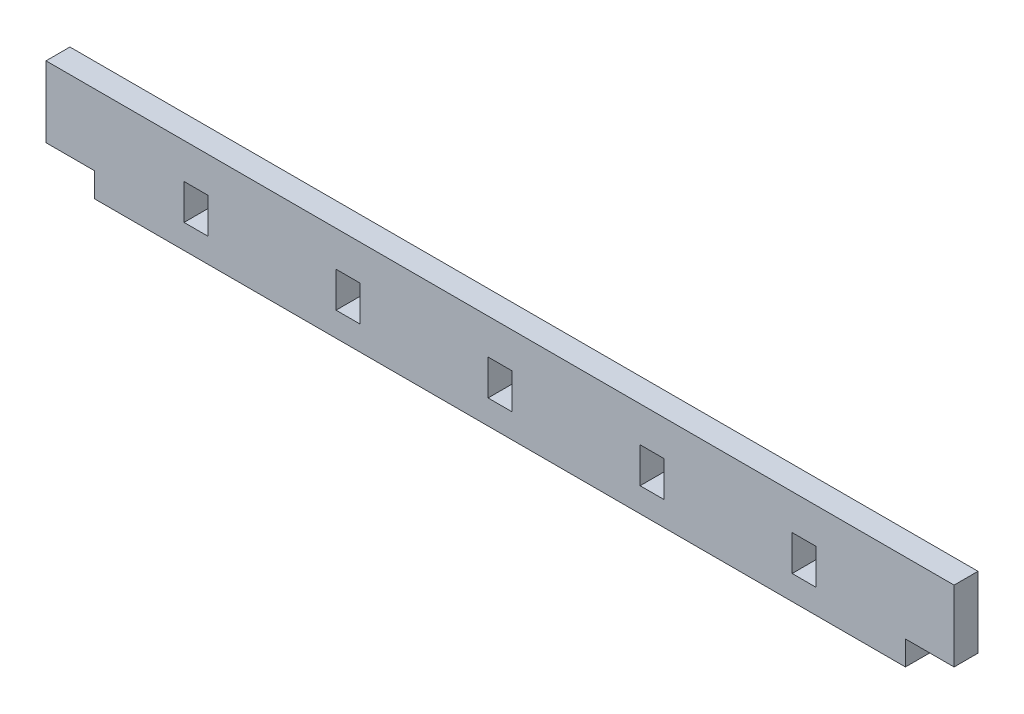
ISO-10303-21;
HEADER;
FILE_DESCRIPTION(('STEP AP214'),'2;1');
FILE_NAME('part.step','',(''),(''),'','','');
FILE_SCHEMA(('AUTOMOTIVE_DESIGN { 1 0 10303 214 1 1 1 1 }'));
ENDSEC;
DATA;
#1=APPLICATION_CONTEXT('core data for automotive mechanical design processes');
#2=APPLICATION_PROTOCOL_DEFINITION('international standard','automotive_design',2000,#1);
#3=PRODUCT_CONTEXT('',#1,'mechanical');
#4=PRODUCT('Part','Part','',(#3));
#5=PRODUCT_RELATED_PRODUCT_CATEGORY('part','',(#4));
#6=PRODUCT_DEFINITION_FORMATION('','',#4);
#7=PRODUCT_DEFINITION_CONTEXT('part definition',#1,'design');
#8=PRODUCT_DEFINITION('design','',#6,#7);
#9=PRODUCT_DEFINITION_SHAPE('','',#8);
#10=(LENGTH_UNIT() NAMED_UNIT(*) SI_UNIT(.MILLI.,.METRE.));
#11=(NAMED_UNIT(*) PLANE_ANGLE_UNIT() SI_UNIT($,.RADIAN.));
#12=(NAMED_UNIT(*) SI_UNIT($,.STERADIAN.) SOLID_ANGLE_UNIT());
#13=UNCERTAINTY_MEASURE_WITH_UNIT(LENGTH_MEASURE(1.E-05),#10,'distance_accuracy_value','');
#14=(GEOMETRIC_REPRESENTATION_CONTEXT(3) GLOBAL_UNCERTAINTY_ASSIGNED_CONTEXT((#13)) GLOBAL_UNIT_ASSIGNED_CONTEXT((#10,
#11,#12)) REPRESENTATION_CONTEXT('',''));
#15=CARTESIAN_POINT('',(0.,0.,0.));
#16=DIRECTION('',(0.,0.,1.));
#17=DIRECTION('',(1.,0.,0.));
#18=AXIS2_PLACEMENT_3D('',#15,#16,#17);
#19=CARTESIAN_POINT('',(0.,0.,2.9972));
#20=DIRECTION('',(0.,0.,1.));
#21=DIRECTION('',(1.,0.,0.));
#22=AXIS2_PLACEMENT_3D('',#19,#20,#21);
#23=PLANE('',#22);
#24=DIRECTION('',(-1.,0.,0.));
#25=VECTOR('',#24,1.);
#26=CARTESIAN_POINT('',(77.4446,14.8328,2.9972));
#27=LINE('',#26,#25);
#28=CARTESIAN_POINT('',(77.4446,14.8328,2.9972));
#29=VERTEX_POINT('',#28);
#30=CARTESIAN_POINT('',(74.4474,14.8328,2.9972));
#31=VERTEX_POINT('',#30);
#32=EDGE_CURVE('E256',#29,#31,#27,.T.);
#33=ORIENTED_EDGE('',*,*,#32,.F.);
#34=DIRECTION('',(0.,1.,0.));
#35=VECTOR('',#34,1.);
#36=CARTESIAN_POINT('',(77.4446,10.3878,2.9972));
#37=LINE('',#36,#35);
#38=CARTESIAN_POINT('',(77.4446,10.3878,2.9972));
#39=VERTEX_POINT('',#38);
#40=EDGE_CURVE('E254',#39,#29,#37,.T.);
#41=ORIENTED_EDGE('',*,*,#40,.F.);
#42=DIRECTION('',(1.,0.,0.));
#43=VECTOR('',#42,1.);
#44=CARTESIAN_POINT('',(77.4446,10.3878,2.9972));
#45=LINE('',#44,#43);
#46=CARTESIAN_POINT('',(74.4474,10.3878,2.9972));
#47=VERTEX_POINT('',#46);
#48=EDGE_CURVE('E262',#47,#39,#45,.T.);
#49=ORIENTED_EDGE('',*,*,#48,.F.);
#50=DIRECTION('',(0.,-1.,0.));
#51=VECTOR('',#50,1.);
#52=CARTESIAN_POINT('',(74.4474,10.3878,2.9972));
#53=LINE('',#52,#51);
#54=EDGE_CURVE('E259',#31,#47,#53,.T.);
#55=ORIENTED_EDGE('',*,*,#54,.F.);
#56=EDGE_LOOP('',(#33,#41,#49,#55));
#57=FACE_BOUND('',#56,.T.);
#58=DIRECTION('',(-1.,0.,0.));
#59=VECTOR('',#58,1.);
#60=CARTESIAN_POINT('',(39.3446,14.8328,2.9972));
#61=LINE('',#60,#59);
#62=CARTESIAN_POINT('',(39.3446,14.8328,2.9972));
#63=VERTEX_POINT('',#62);
#64=CARTESIAN_POINT('',(36.3474,14.8328,2.9972));
#65=VERTEX_POINT('',#64);
#66=EDGE_CURVE('E318',#63,#65,#61,.T.);
#67=ORIENTED_EDGE('',*,*,#66,.F.);
#68=DIRECTION('',(0.,1.,0.));
#69=VECTOR('',#68,1.);
#70=CARTESIAN_POINT('',(39.3446,10.3878,2.9972));
#71=LINE('',#70,#69);
#72=CARTESIAN_POINT('',(39.3446,10.3878,2.9972));
#73=VERTEX_POINT('',#72);
#74=EDGE_CURVE('E316',#73,#63,#71,.T.);
#75=ORIENTED_EDGE('',*,*,#74,.F.);
#76=DIRECTION('',(1.,0.,0.));
#77=VECTOR('',#76,1.);
#78=CARTESIAN_POINT('',(39.3446,10.3878,2.9972));
#79=LINE('',#78,#77);
#80=CARTESIAN_POINT('',(36.3474,10.3878,2.9972));
#81=VERTEX_POINT('',#80);
#82=EDGE_CURVE('E324',#81,#73,#79,.T.);
#83=ORIENTED_EDGE('',*,*,#82,.F.);
#84=DIRECTION('',(0.,-1.,0.));
#85=VECTOR('',#84,1.);
#86=CARTESIAN_POINT('',(36.3474,10.3878,2.9972));
#87=LINE('',#86,#85);
#88=EDGE_CURVE('E321',#65,#81,#87,.T.);
#89=ORIENTED_EDGE('',*,*,#88,.F.);
#90=EDGE_LOOP('',(#67,#75,#83,#89));
#91=FACE_BOUND('',#90,.T.);
#92=DIRECTION('',(-1.,0.,0.));
#93=VECTOR('',#92,1.);
#94=CARTESIAN_POINT('',(6.096,19.2778,2.9972));
#95=LINE('',#94,#93);
#96=CARTESIAN_POINT('',(113.792,19.2778,2.9972));
#97=VERTEX_POINT('',#96);
#98=CARTESIAN_POINT('',(0.,19.2778,2.9972));
#99=VERTEX_POINT('',#98);
#100=EDGE_CURVE('E378',#97,#99,#95,.T.);
#101=ORIENTED_EDGE('',*,*,#100,.T.);
#102=DIRECTION('',(0.,-1.,0.));
#103=VECTOR('',#102,1.);
#104=CARTESIAN_POINT('',(0.,19.2778,2.9972));
#105=LINE('',#104,#103);
#106=CARTESIAN_POINT('',(0.,10.3878,2.9972));
#107=VERTEX_POINT('',#106);
#108=EDGE_CURVE('E381',#99,#107,#105,.T.);
#109=ORIENTED_EDGE('',*,*,#108,.T.);
#110=DIRECTION('',(1.,0.,0.));
#111=VECTOR('',#110,1.);
#112=CARTESIAN_POINT('',(6.096,10.3878,2.9972));
#113=LINE('',#112,#111);
#114=CARTESIAN_POINT('',(6.096,10.3878,2.9972));
#115=VERTEX_POINT('',#114);
#116=EDGE_CURVE('E384',#107,#115,#113,.T.);
#117=ORIENTED_EDGE('',*,*,#116,.T.);
#118=DIRECTION('',(0.,-1.,0.));
#119=VECTOR('',#118,1.);
#120=CARTESIAN_POINT('',(6.096,7.33979999999998,2.9972));
#121=LINE('',#120,#119);
#122=CARTESIAN_POINT('',(6.096,7.33979999999998,2.9972));
#123=VERTEX_POINT('',#122);
#124=EDGE_CURVE('E386',#115,#123,#121,.T.);
#125=ORIENTED_EDGE('',*,*,#124,.T.);
#126=DIRECTION('',(1.,0.,0.));
#127=VECTOR('',#126,1.);
#128=CARTESIAN_POINT('',(107.696,7.33979999999999,2.9972));
#129=LINE('',#128,#127);
#130=CARTESIAN_POINT('',(107.696,7.33979999999999,2.9972));
#131=VERTEX_POINT('',#130);
#132=EDGE_CURVE('E388',#123,#131,#129,.T.);
#133=ORIENTED_EDGE('',*,*,#132,.T.);
#134=DIRECTION('',(0.,1.,0.));
#135=VECTOR('',#134,1.);
#136=CARTESIAN_POINT('',(107.696,10.3878,2.9972));
#137=LINE('',#136,#135);
#138=CARTESIAN_POINT('',(107.696,10.3878,2.9972));
#139=VERTEX_POINT('',#138);
#140=EDGE_CURVE('E390',#131,#139,#137,.T.);
#141=ORIENTED_EDGE('',*,*,#140,.T.);
#142=DIRECTION('',(1.,0.,0.));
#143=VECTOR('',#142,1.);
#144=CARTESIAN_POINT('',(113.792,10.3878,2.9972));
#145=LINE('',#144,#143);
#146=CARTESIAN_POINT('',(113.792,10.3878,2.9972));
#147=VERTEX_POINT('',#146);
#148=EDGE_CURVE('E392',#139,#147,#145,.T.);
#149=ORIENTED_EDGE('',*,*,#148,.T.);
#150=DIRECTION('',(0.,1.,0.));
#151=VECTOR('',#150,1.);
#152=CARTESIAN_POINT('',(113.792,19.2778,2.9972));
#153=LINE('',#152,#151);
#154=EDGE_CURVE('E394',#147,#97,#153,.T.);
#155=ORIENTED_EDGE('',*,*,#154,.T.);
#156=EDGE_LOOP('',(#101,#109,#117,#125,#133,#141,#149,#155));
#157=FACE_BOUND('',#156,.T.);
#158=DIRECTION('',(-1.,0.,0.));
#159=VECTOR('',#158,1.);
#160=CARTESIAN_POINT('',(20.2946,14.8328,2.9972));
#161=LINE('',#160,#159);
#162=CARTESIAN_POINT('',(20.2946,14.8328,2.9972));
#163=VERTEX_POINT('',#162);
#164=CARTESIAN_POINT('',(17.2974,14.8328,2.9972));
#165=VERTEX_POINT('',#164);
#166=EDGE_CURVE('E349',#163,#165,#161,.T.);
#167=ORIENTED_EDGE('',*,*,#166,.F.);
#168=DIRECTION('',(0.,1.,0.));
#169=VECTOR('',#168,1.);
#170=CARTESIAN_POINT('',(20.2946,10.3878,2.9972));
#171=LINE('',#170,#169);
#172=CARTESIAN_POINT('',(20.2946,10.3878,2.9972));
#173=VERTEX_POINT('',#172);
#174=EDGE_CURVE('E347',#173,#163,#171,.T.);
#175=ORIENTED_EDGE('',*,*,#174,.F.);
#176=DIRECTION('',(1.,0.,0.));
#177=VECTOR('',#176,1.);
#178=CARTESIAN_POINT('',(20.2946,10.3878,2.9972));
#179=LINE('',#178,#177);
#180=CARTESIAN_POINT('',(17.2974,10.3878,2.9972));
#181=VERTEX_POINT('',#180);
#182=EDGE_CURVE('E355',#181,#173,#179,.T.);
#183=ORIENTED_EDGE('',*,*,#182,.F.);
#184=DIRECTION('',(0.,-1.,0.));
#185=VECTOR('',#184,1.);
#186=CARTESIAN_POINT('',(17.2974,10.3878,2.9972));
#187=LINE('',#186,#185);
#188=EDGE_CURVE('E352',#165,#181,#187,.T.);
#189=ORIENTED_EDGE('',*,*,#188,.F.);
#190=EDGE_LOOP('',(#167,#175,#183,#189));
#191=FACE_BOUND('',#190,.T.);
#192=DIRECTION('',(0.,1.,0.));
#193=VECTOR('',#192,1.);
#194=CARTESIAN_POINT('',(58.3946,10.3878,2.9972));
#195=LINE('',#194,#193);
#196=CARTESIAN_POINT('',(58.3946,10.3878,2.9972));
#197=VERTEX_POINT('',#196);
#198=CARTESIAN_POINT('',(58.3946,14.8328,2.9972));
#199=VERTEX_POINT('',#198);
#200=EDGE_CURVE('E287',#197,#199,#195,.T.);
#201=ORIENTED_EDGE('',*,*,#200,.F.);
#202=DIRECTION('',(1.,0.,0.));
#203=VECTOR('',#202,1.);
#204=CARTESIAN_POINT('',(58.3946,10.3878,2.9972));
#205=LINE('',#204,#203);
#206=CARTESIAN_POINT('',(55.3974,10.3878,2.9972));
#207=VERTEX_POINT('',#206);
#208=EDGE_CURVE('E285',#207,#197,#205,.T.);
#209=ORIENTED_EDGE('',*,*,#208,.F.);
#210=DIRECTION('',(0.,-1.,0.));
#211=VECTOR('',#210,1.);
#212=CARTESIAN_POINT('',(55.3974,10.3878,2.9972));
#213=LINE('',#212,#211);
#214=CARTESIAN_POINT('',(55.3974,14.8328,2.9972));
#215=VERTEX_POINT('',#214);
#216=EDGE_CURVE('E293',#215,#207,#213,.T.);
#217=ORIENTED_EDGE('',*,*,#216,.F.);
#218=DIRECTION('',(-1.,0.,0.));
#219=VECTOR('',#218,1.);
#220=CARTESIAN_POINT('',(58.3946,14.8328,2.9972));
#221=LINE('',#220,#219);
#222=EDGE_CURVE('E290',#199,#215,#221,.T.);
#223=ORIENTED_EDGE('',*,*,#222,.F.);
#224=EDGE_LOOP('',(#201,#209,#217,#223));
#225=FACE_BOUND('',#224,.T.);
#226=DIRECTION('',(-1.,0.,0.));
#227=VECTOR('',#226,1.);
#228=CARTESIAN_POINT('',(96.4946,14.8328,2.9972));
#229=LINE('',#228,#227);
#230=CARTESIAN_POINT('',(96.4946,14.8328,2.9972));
#231=VERTEX_POINT('',#230);
#232=CARTESIAN_POINT('',(93.4974,14.8328,2.9972));
#233=VERTEX_POINT('',#232);
#234=EDGE_CURVE('E226',#231,#233,#229,.T.);
#235=ORIENTED_EDGE('',*,*,#234,.F.);
#236=DIRECTION('',(0.,1.,0.));
#237=VECTOR('',#236,1.);
#238=CARTESIAN_POINT('',(96.4946,10.3878,2.9972));
#239=LINE('',#238,#237);
#240=CARTESIAN_POINT('',(96.4946,10.3878,2.9972));
#241=VERTEX_POINT('',#240);
#242=EDGE_CURVE('E218',#241,#231,#239,.T.);
#243=ORIENTED_EDGE('',*,*,#242,.F.);
#244=DIRECTION('',(1.,0.,0.));
#245=VECTOR('',#244,1.);
#246=CARTESIAN_POINT('',(96.4946,10.3878,2.9972));
#247=LINE('',#246,#245);
#248=CARTESIAN_POINT('',(93.4974,10.3878,2.9972));
#249=VERTEX_POINT('',#248);
#250=EDGE_CURVE('E240',#249,#241,#247,.T.);
#251=ORIENTED_EDGE('',*,*,#250,.F.);
#252=DIRECTION('',(0.,-1.,0.));
#253=VECTOR('',#252,1.);
#254=CARTESIAN_POINT('',(93.4974,10.3878,2.9972));
#255=LINE('',#254,#253);
#256=EDGE_CURVE('E238',#233,#249,#255,.T.);
#257=ORIENTED_EDGE('',*,*,#256,.F.);
#258=EDGE_LOOP('',(#235,#243,#251,#257));
#259=FACE_BOUND('',#258,.T.);
#260=ADVANCED_FACE('F33',(#57,#91,#157,#191,#225,#259),#23,.T.);
#261=CARTESIAN_POINT('',(0.,0.,0.));
#262=DIRECTION('',(0.,0.,1.));
#263=DIRECTION('',(1.,0.,0.));
#264=AXIS2_PLACEMENT_3D('',#261,#262,#263);
#265=PLANE('',#264);
#266=DIRECTION('',(0.,1.,0.));
#267=VECTOR('',#266,1.);
#268=CARTESIAN_POINT('',(77.4446,10.3878,0.));
#269=LINE('',#268,#267);
#270=CARTESIAN_POINT('',(77.4446,10.3878,0.));
#271=VERTEX_POINT('',#270);
#272=CARTESIAN_POINT('',(77.4446,14.8328,0.));
#273=VERTEX_POINT('',#272);
#274=EDGE_CURVE('E234',#271,#273,#269,.T.);
#275=ORIENTED_EDGE('',*,*,#274,.T.);
#276=DIRECTION('',(-1.,0.,0.));
#277=VECTOR('',#276,1.);
#278=CARTESIAN_POINT('',(77.4446,14.8328,0.));
#279=LINE('',#278,#277);
#280=CARTESIAN_POINT('',(74.4474,14.8328,0.));
#281=VERTEX_POINT('',#280);
#282=EDGE_CURVE('E267',#273,#281,#279,.T.);
#283=ORIENTED_EDGE('',*,*,#282,.T.);
#284=DIRECTION('',(0.,-1.,0.));
#285=VECTOR('',#284,1.);
#286=CARTESIAN_POINT('',(74.4474,10.3878,0.));
#287=LINE('',#286,#285);
#288=CARTESIAN_POINT('',(74.4474,10.3878,0.));
#289=VERTEX_POINT('',#288);
#290=EDGE_CURVE('E270',#281,#289,#287,.T.);
#291=ORIENTED_EDGE('',*,*,#290,.T.);
#292=DIRECTION('',(1.,0.,0.));
#293=VECTOR('',#292,1.);
#294=CARTESIAN_POINT('',(77.4446,10.3878,0.));
#295=LINE('',#294,#293);
#296=EDGE_CURVE('E257',#289,#271,#295,.T.);
#297=ORIENTED_EDGE('',*,*,#296,.T.);
#298=EDGE_LOOP('',(#275,#283,#291,#297));
#299=FACE_BOUND('',#298,.T.);
#300=DIRECTION('',(0.,1.,0.));
#301=VECTOR('',#300,1.);
#302=CARTESIAN_POINT('',(39.3446,10.3878,0.));
#303=LINE('',#302,#301);
#304=CARTESIAN_POINT('',(39.3446,10.3878,0.));
#305=VERTEX_POINT('',#304);
#306=CARTESIAN_POINT('',(39.3446,14.8328,0.));
#307=VERTEX_POINT('',#306);
#308=EDGE_CURVE('E315',#305,#307,#303,.T.);
#309=ORIENTED_EDGE('',*,*,#308,.T.);
#310=DIRECTION('',(-1.,0.,0.));
#311=VECTOR('',#310,1.);
#312=CARTESIAN_POINT('',(39.3446,14.8328,0.));
#313=LINE('',#312,#311);
#314=CARTESIAN_POINT('',(36.3474,14.8328,0.));
#315=VERTEX_POINT('',#314);
#316=EDGE_CURVE('E329',#307,#315,#313,.T.);
#317=ORIENTED_EDGE('',*,*,#316,.T.);
#318=DIRECTION('',(0.,-1.,0.));
#319=VECTOR('',#318,1.);
#320=CARTESIAN_POINT('',(36.3474,10.3878,0.));
#321=LINE('',#320,#319);
#322=CARTESIAN_POINT('',(36.3474,10.3878,0.));
#323=VERTEX_POINT('',#322);
#324=EDGE_CURVE('E332',#315,#323,#321,.T.);
#325=ORIENTED_EDGE('',*,*,#324,.T.);
#326=DIRECTION('',(1.,0.,0.));
#327=VECTOR('',#326,1.);
#328=CARTESIAN_POINT('',(39.3446,10.3878,0.));
#329=LINE('',#328,#327);
#330=EDGE_CURVE('E319',#323,#305,#329,.T.);
#331=ORIENTED_EDGE('',*,*,#330,.T.);
#332=EDGE_LOOP('',(#309,#317,#325,#331));
#333=FACE_BOUND('',#332,.T.);
#334=DIRECTION('',(0.,-1.,0.));
#335=VECTOR('',#334,1.);
#336=CARTESIAN_POINT('',(0.,19.2778,0.));
#337=LINE('',#336,#335);
#338=CARTESIAN_POINT('',(0.,19.2778,0.));
#339=VERTEX_POINT('',#338);
#340=CARTESIAN_POINT('',(0.,10.3878,0.));
#341=VERTEX_POINT('',#340);
#342=EDGE_CURVE('E377',#339,#341,#337,.T.);
#343=ORIENTED_EDGE('',*,*,#342,.F.);
#344=DIRECTION('',(-1.,0.,0.));
#345=VECTOR('',#344,1.);
#346=CARTESIAN_POINT('',(6.096,19.2778,0.));
#347=LINE('',#346,#345);
#348=CARTESIAN_POINT('',(113.792,19.2778,0.));
#349=VERTEX_POINT('',#348);
#350=EDGE_CURVE('E382',#349,#339,#347,.T.);
#351=ORIENTED_EDGE('',*,*,#350,.F.);
#352=DIRECTION('',(0.,1.,0.));
#353=VECTOR('',#352,1.);
#354=CARTESIAN_POINT('',(113.792,19.2778,0.));
#355=LINE('',#354,#353);
#356=CARTESIAN_POINT('',(113.792,10.3878,0.));
#357=VERTEX_POINT('',#356);
#358=EDGE_CURVE('E409',#357,#349,#355,.T.);
#359=ORIENTED_EDGE('',*,*,#358,.F.);
#360=DIRECTION('',(1.,0.,0.));
#361=VECTOR('',#360,1.);
#362=CARTESIAN_POINT('',(113.792,10.3878,0.));
#363=LINE('',#362,#361);
#364=CARTESIAN_POINT('',(107.696,10.3878,0.));
#365=VERTEX_POINT('',#364);
#366=EDGE_CURVE('E407',#365,#357,#363,.T.);
#367=ORIENTED_EDGE('',*,*,#366,.F.);
#368=DIRECTION('',(0.,1.,0.));
#369=VECTOR('',#368,1.);
#370=CARTESIAN_POINT('',(107.696,10.3878,0.));
#371=LINE('',#370,#369);
#372=CARTESIAN_POINT('',(107.696,7.33979999999999,0.));
#373=VERTEX_POINT('',#372);
#374=EDGE_CURVE('E405',#373,#365,#371,.T.);
#375=ORIENTED_EDGE('',*,*,#374,.F.);
#376=DIRECTION('',(1.,0.,0.));
#377=VECTOR('',#376,1.);
#378=CARTESIAN_POINT('',(107.696,7.33979999999999,0.));
#379=LINE('',#378,#377);
#380=CARTESIAN_POINT('',(6.096,7.33979999999998,0.));
#381=VERTEX_POINT('',#380);
#382=EDGE_CURVE('E403',#381,#373,#379,.T.);
#383=ORIENTED_EDGE('',*,*,#382,.F.);
#384=DIRECTION('',(0.,-1.,0.));
#385=VECTOR('',#384,1.);
#386=CARTESIAN_POINT('',(6.096,7.33979999999998,0.));
#387=LINE('',#386,#385);
#388=CARTESIAN_POINT('',(6.096,10.3878,0.));
#389=VERTEX_POINT('',#388);
#390=EDGE_CURVE('E401',#389,#381,#387,.T.);
#391=ORIENTED_EDGE('',*,*,#390,.F.);
#392=DIRECTION('',(1.,0.,0.));
#393=VECTOR('',#392,1.);
#394=CARTESIAN_POINT('',(6.096,10.3878,0.));
#395=LINE('',#394,#393);
#396=EDGE_CURVE('E399',#341,#389,#395,.T.);
#397=ORIENTED_EDGE('',*,*,#396,.F.);
#398=EDGE_LOOP('',(#343,#351,#359,#367,#375,#383,#391,#397));
#399=FACE_BOUND('',#398,.T.);
#400=DIRECTION('',(0.,1.,0.));
#401=VECTOR('',#400,1.);
#402=CARTESIAN_POINT('',(20.2946,10.3878,0.));
#403=LINE('',#402,#401);
#404=CARTESIAN_POINT('',(20.2946,10.3878,0.));
#405=VERTEX_POINT('',#404);
#406=CARTESIAN_POINT('',(20.2946,14.8328,0.));
#407=VERTEX_POINT('',#406);
#408=EDGE_CURVE('E346',#405,#407,#403,.T.);
#409=ORIENTED_EDGE('',*,*,#408,.T.);
#410=DIRECTION('',(-1.,0.,0.));
#411=VECTOR('',#410,1.);
#412=CARTESIAN_POINT('',(20.2946,14.8328,0.));
#413=LINE('',#412,#411);
#414=CARTESIAN_POINT('',(17.2974,14.8328,0.));
#415=VERTEX_POINT('',#414);
#416=EDGE_CURVE('E360',#407,#415,#413,.T.);
#417=ORIENTED_EDGE('',*,*,#416,.T.);
#418=DIRECTION('',(0.,-1.,0.));
#419=VECTOR('',#418,1.);
#420=CARTESIAN_POINT('',(17.2974,10.3878,0.));
#421=LINE('',#420,#419);
#422=CARTESIAN_POINT('',(17.2974,10.3878,0.));
#423=VERTEX_POINT('',#422);
#424=EDGE_CURVE('E363',#415,#423,#421,.T.);
#425=ORIENTED_EDGE('',*,*,#424,.T.);
#426=DIRECTION('',(1.,0.,0.));
#427=VECTOR('',#426,1.);
#428=CARTESIAN_POINT('',(20.2946,10.3878,0.));
#429=LINE('',#428,#427);
#430=EDGE_CURVE('E350',#423,#405,#429,.T.);
#431=ORIENTED_EDGE('',*,*,#430,.T.);
#432=EDGE_LOOP('',(#409,#417,#425,#431));
#433=FACE_BOUND('',#432,.T.);
#434=DIRECTION('',(1.,0.,0.));
#435=VECTOR('',#434,1.);
#436=CARTESIAN_POINT('',(58.3946,10.3878,0.));
#437=LINE('',#436,#435);
#438=CARTESIAN_POINT('',(55.3974,10.3878,0.));
#439=VERTEX_POINT('',#438);
#440=CARTESIAN_POINT('',(58.3946,10.3878,0.));
#441=VERTEX_POINT('',#440);
#442=EDGE_CURVE('E284',#439,#441,#437,.T.);
#443=ORIENTED_EDGE('',*,*,#442,.T.);
#444=DIRECTION('',(0.,1.,0.));
#445=VECTOR('',#444,1.);
#446=CARTESIAN_POINT('',(58.3946,10.3878,0.));
#447=LINE('',#446,#445);
#448=CARTESIAN_POINT('',(58.3946,14.8328,0.));
#449=VERTEX_POINT('',#448);
#450=EDGE_CURVE('E298',#441,#449,#447,.T.);
#451=ORIENTED_EDGE('',*,*,#450,.T.);
#452=DIRECTION('',(-1.,0.,0.));
#453=VECTOR('',#452,1.);
#454=CARTESIAN_POINT('',(58.3946,14.8328,0.));
#455=LINE('',#454,#453);
#456=CARTESIAN_POINT('',(55.3974,14.8328,0.));
#457=VERTEX_POINT('',#456);
#458=EDGE_CURVE('E301',#449,#457,#455,.T.);
#459=ORIENTED_EDGE('',*,*,#458,.T.);
#460=DIRECTION('',(0.,-1.,0.));
#461=VECTOR('',#460,1.);
#462=CARTESIAN_POINT('',(55.3974,10.3878,0.));
#463=LINE('',#462,#461);
#464=EDGE_CURVE('E288',#457,#439,#463,.T.);
#465=ORIENTED_EDGE('',*,*,#464,.T.);
#466=EDGE_LOOP('',(#443,#451,#459,#465));
#467=FACE_BOUND('',#466,.T.);
#468=DIRECTION('',(0.,1.,0.));
#469=VECTOR('',#468,1.);
#470=CARTESIAN_POINT('',(96.4946,10.3878,0.));
#471=LINE('',#470,#469);
#472=CARTESIAN_POINT('',(96.4946,10.3878,0.));
#473=VERTEX_POINT('',#472);
#474=CARTESIAN_POINT('',(96.4946,14.8328,0.));
#475=VERTEX_POINT('',#474);
#476=EDGE_CURVE('E56',#473,#475,#471,.T.);
#477=ORIENTED_EDGE('',*,*,#476,.T.);
#478=DIRECTION('',(-1.,0.,0.));
#479=VECTOR('',#478,1.);
#480=CARTESIAN_POINT('',(96.4946,14.8328,0.));
#481=LINE('',#480,#479);
#482=CARTESIAN_POINT('',(93.4974,14.8328,0.));
#483=VERTEX_POINT('',#482);
#484=EDGE_CURVE('E233',#475,#483,#481,.T.);
#485=ORIENTED_EDGE('',*,*,#484,.T.);
#486=DIRECTION('',(0.,-1.,0.));
#487=VECTOR('',#486,1.);
#488=CARTESIAN_POINT('',(93.4974,10.3878,0.));
#489=LINE('',#488,#487);
#490=CARTESIAN_POINT('',(93.4974,10.3878,0.));
#491=VERTEX_POINT('',#490);
#492=EDGE_CURVE('E246',#483,#491,#489,.T.);
#493=ORIENTED_EDGE('',*,*,#492,.T.);
#494=DIRECTION('',(1.,0.,0.));
#495=VECTOR('',#494,1.);
#496=CARTESIAN_POINT('',(96.4946,10.3878,0.));
#497=LINE('',#496,#495);
#498=EDGE_CURVE('E227',#491,#473,#497,.T.);
#499=ORIENTED_EDGE('',*,*,#498,.T.);
#500=EDGE_LOOP('',(#477,#485,#493,#499));
#501=FACE_BOUND('',#500,.T.);
#502=ADVANCED_FACE('F440',(#299,#333,#399,#433,#467,#501),#265,.F.);
#503=CARTESIAN_POINT('',(0.,19.2778,2.9972));
#504=DIRECTION('',(1.,0.,0.));
#505=DIRECTION('',(0.,0.,-1.));
#506=AXIS2_PLACEMENT_3D('',#503,#504,#505);
#507=PLANE('',#506);
#508=ORIENTED_EDGE('',*,*,#342,.T.);
#509=DIRECTION('',(0.,0.,-1.));
#510=VECTOR('',#509,1.);
#511=CARTESIAN_POINT('',(0.,10.3878,2.9972));
#512=LINE('',#511,#510);
#513=EDGE_CURVE('E41',#107,#341,#512,.T.);
#514=ORIENTED_EDGE('',*,*,#513,.F.);
#515=ORIENTED_EDGE('',*,*,#108,.F.);
#516=DIRECTION('',(0.,0.,-1.));
#517=VECTOR('',#516,1.);
#518=CARTESIAN_POINT('',(0.,19.2778,2.9972));
#519=LINE('',#518,#517);
#520=EDGE_CURVE('E11',#99,#339,#519,.T.);
#521=ORIENTED_EDGE('',*,*,#520,.T.);
#522=EDGE_LOOP('',(#508,#514,#515,#521));
#523=FACE_BOUND('',#522,.T.);
#524=ADVANCED_FACE('F35',(#523),#507,.F.);
#525=CARTESIAN_POINT('',(6.096,10.3878,2.9972));
#526=DIRECTION('',(0.,1.,0.));
#527=DIRECTION('',(0.,0.,1.));
#528=AXIS2_PLACEMENT_3D('',#525,#526,#527);
#529=PLANE('',#528);
#530=ORIENTED_EDGE('',*,*,#396,.T.);
#531=DIRECTION('',(0.,0.,-1.));
#532=VECTOR('',#531,1.);
#533=CARTESIAN_POINT('',(6.096,10.3878,2.9972));
#534=LINE('',#533,#532);
#535=EDGE_CURVE('E427',#115,#389,#534,.T.);
#536=ORIENTED_EDGE('',*,*,#535,.F.);
#537=ORIENTED_EDGE('',*,*,#116,.F.);
#538=ORIENTED_EDGE('',*,*,#513,.T.);
#539=EDGE_LOOP('',(#530,#536,#537,#538));
#540=FACE_BOUND('',#539,.T.);
#541=ADVANCED_FACE('F434',(#540),#529,.F.);
#542=CARTESIAN_POINT('',(6.096,7.33979999999998,2.9972));
#543=DIRECTION('',(1.,0.,0.));
#544=DIRECTION('',(0.,1.,0.));
#545=AXIS2_PLACEMENT_3D('',#542,#543,#544);
#546=PLANE('',#545);
#547=ORIENTED_EDGE('',*,*,#390,.T.);
#548=DIRECTION('',(0.,0.,-1.));
#549=VECTOR('',#548,1.);
#550=CARTESIAN_POINT('',(6.096,7.33979999999998,2.9972));
#551=LINE('',#550,#549);
#552=EDGE_CURVE('E424',#123,#381,#551,.T.);
#553=ORIENTED_EDGE('',*,*,#552,.F.);
#554=ORIENTED_EDGE('',*,*,#124,.F.);
#555=ORIENTED_EDGE('',*,*,#535,.T.);
#556=EDGE_LOOP('',(#547,#553,#554,#555));
#557=FACE_BOUND('',#556,.T.);
#558=ADVANCED_FACE('F446',(#557),#546,.F.);
#559=CARTESIAN_POINT('',(107.696,7.33979999999999,2.9972));
#560=DIRECTION('',(0.,1.,0.));
#561=DIRECTION('',(-1.,0.,0.));
#562=AXIS2_PLACEMENT_3D('',#559,#560,#561);
#563=PLANE('',#562);
#564=ORIENTED_EDGE('',*,*,#382,.T.);
#565=DIRECTION('',(0.,0.,-1.));
#566=VECTOR('',#565,1.);
#567=CARTESIAN_POINT('',(107.696,7.33979999999999,2.9972));
#568=LINE('',#567,#566);
#569=EDGE_CURVE('E421',#131,#373,#568,.T.);
#570=ORIENTED_EDGE('',*,*,#569,.F.);
#571=ORIENTED_EDGE('',*,*,#132,.F.);
#572=ORIENTED_EDGE('',*,*,#552,.T.);
#573=EDGE_LOOP('',(#564,#570,#571,#572));
#574=FACE_BOUND('',#573,.T.);
#575=ADVANCED_FACE('F450',(#574),#563,.F.);
#576=CARTESIAN_POINT('',(107.696,10.3878,2.9972));
#577=DIRECTION('',(-1.,0.,0.));
#578=DIRECTION('',(0.,0.,1.));
#579=AXIS2_PLACEMENT_3D('',#576,#577,#578);
#580=PLANE('',#579);
#581=ORIENTED_EDGE('',*,*,#374,.T.);
#582=DIRECTION('',(0.,0.,-1.));
#583=VECTOR('',#582,1.);
#584=CARTESIAN_POINT('',(107.696,10.3878,2.9972));
#585=LINE('',#584,#583);
#586=EDGE_CURVE('E418',#139,#365,#585,.T.);
#587=ORIENTED_EDGE('',*,*,#586,.F.);
#588=ORIENTED_EDGE('',*,*,#140,.F.);
#589=ORIENTED_EDGE('',*,*,#569,.T.);
#590=EDGE_LOOP('',(#581,#587,#588,#589));
#591=FACE_BOUND('',#590,.T.);
#592=ADVANCED_FACE('F470',(#591),#580,.F.);
#593=CARTESIAN_POINT('',(113.792,10.3878,2.9972));
#594=DIRECTION('',(0.,1.,0.));
#595=DIRECTION('',(0.,0.,1.));
#596=AXIS2_PLACEMENT_3D('',#593,#594,#595);
#597=PLANE('',#596);
#598=ORIENTED_EDGE('',*,*,#366,.T.);
#599=DIRECTION('',(0.,0.,-1.));
#600=VECTOR('',#599,1.);
#601=CARTESIAN_POINT('',(113.792,10.3878,2.9972));
#602=LINE('',#601,#600);
#603=EDGE_CURVE('E415',#147,#357,#602,.T.);
#604=ORIENTED_EDGE('',*,*,#603,.F.);
#605=ORIENTED_EDGE('',*,*,#148,.F.);
#606=ORIENTED_EDGE('',*,*,#586,.T.);
#607=EDGE_LOOP('',(#598,#604,#605,#606));
#608=FACE_BOUND('',#607,.T.);
#609=ADVANCED_FACE('F468',(#608),#597,.F.);
#610=CARTESIAN_POINT('',(113.792,19.2778,2.9972));
#611=DIRECTION('',(-1.,0.,0.));
#612=DIRECTION('',(0.,0.,1.));
#613=AXIS2_PLACEMENT_3D('',#610,#611,#612);
#614=PLANE('',#613);
#615=ORIENTED_EDGE('',*,*,#358,.T.);
#616=DIRECTION('',(0.,0.,-1.));
#617=VECTOR('',#616,1.);
#618=CARTESIAN_POINT('',(113.792,19.2778,2.9972));
#619=LINE('',#618,#617);
#620=EDGE_CURVE('E397',#97,#349,#619,.T.);
#621=ORIENTED_EDGE('',*,*,#620,.F.);
#622=ORIENTED_EDGE('',*,*,#154,.F.);
#623=ORIENTED_EDGE('',*,*,#603,.T.);
#624=EDGE_LOOP('',(#615,#621,#622,#623));
#625=FACE_BOUND('',#624,.T.);
#626=ADVANCED_FACE('F463',(#625),#614,.F.);
#627=CARTESIAN_POINT('',(6.096,19.2778,2.9972));
#628=DIRECTION('',(0.,-1.,0.));
#629=DIRECTION('',(0.,0.,-1.));
#630=AXIS2_PLACEMENT_3D('',#627,#628,#629);
#631=PLANE('',#630);
#632=ORIENTED_EDGE('',*,*,#350,.T.);
#633=ORIENTED_EDGE('',*,*,#520,.F.);
#634=ORIENTED_EDGE('',*,*,#100,.F.);
#635=ORIENTED_EDGE('',*,*,#620,.T.);
#636=EDGE_LOOP('',(#632,#633,#634,#635));
#637=FACE_BOUND('',#636,.T.);
#638=ADVANCED_FACE('F458',(#637),#631,.F.);
#639=CARTESIAN_POINT('',(20.2946,10.3878,2.9972));
#640=DIRECTION('',(-1.,0.,0.));
#641=DIRECTION('',(0.,0.,1.));
#642=AXIS2_PLACEMENT_3D('',#639,#640,#641);
#643=PLANE('',#642);
#644=ORIENTED_EDGE('',*,*,#408,.F.);
#645=DIRECTION('',(0.,0.,-1.));
#646=VECTOR('',#645,1.);
#647=CARTESIAN_POINT('',(20.2946,10.3878,2.9972));
#648=LINE('',#647,#646);
#649=EDGE_CURVE('E357',#173,#405,#648,.T.);
#650=ORIENTED_EDGE('',*,*,#649,.F.);
#651=ORIENTED_EDGE('',*,*,#174,.T.);
#652=DIRECTION('',(0.,0.,-1.));
#653=VECTOR('',#652,1.);
#654=CARTESIAN_POINT('',(20.2946,14.8328,2.9972));
#655=LINE('',#654,#653);
#656=EDGE_CURVE('E374',#163,#407,#655,.T.);
#657=ORIENTED_EDGE('',*,*,#656,.T.);
#658=EDGE_LOOP('',(#644,#650,#651,#657));
#659=FACE_BOUND('',#658,.T.);
#660=ADVANCED_FACE('F490',(#659),#643,.T.);
#661=CARTESIAN_POINT('',(20.2946,14.8328,2.9972));
#662=DIRECTION('',(0.,-1.,0.));
#663=DIRECTION('',(0.,0.,-1.));
#664=AXIS2_PLACEMENT_3D('',#661,#662,#663);
#665=PLANE('',#664);
#666=ORIENTED_EDGE('',*,*,#416,.F.);
#667=ORIENTED_EDGE('',*,*,#656,.F.);
#668=ORIENTED_EDGE('',*,*,#166,.T.);
#669=DIRECTION('',(0.,0.,-1.));
#670=VECTOR('',#669,1.);
#671=CARTESIAN_POINT('',(17.2974,14.8328,2.9972));
#672=LINE('',#671,#670);
#673=EDGE_CURVE('E372',#165,#415,#672,.T.);
#674=ORIENTED_EDGE('',*,*,#673,.T.);
#675=EDGE_LOOP('',(#666,#667,#668,#674));
#676=FACE_BOUND('',#675,.T.);
#677=ADVANCED_FACE('F510',(#676),#665,.T.);
#678=CARTESIAN_POINT('',(17.2974,10.3878,2.9972));
#679=DIRECTION('',(1.,0.,0.));
#680=DIRECTION('',(0.,0.,-1.));
#681=AXIS2_PLACEMENT_3D('',#678,#679,#680);
#682=PLANE('',#681);
#683=ORIENTED_EDGE('',*,*,#424,.F.);
#684=ORIENTED_EDGE('',*,*,#673,.F.);
#685=ORIENTED_EDGE('',*,*,#188,.T.);
#686=DIRECTION('',(0.,0.,-1.));
#687=VECTOR('',#686,1.);
#688=CARTESIAN_POINT('',(17.2974,10.3878,2.9972));
#689=LINE('',#688,#687);
#690=EDGE_CURVE('E370',#181,#423,#689,.T.);
#691=ORIENTED_EDGE('',*,*,#690,.T.);
#692=EDGE_LOOP('',(#683,#684,#685,#691));
#693=FACE_BOUND('',#692,.T.);
#694=ADVANCED_FACE('F517',(#693),#682,.T.);
#695=CARTESIAN_POINT('',(20.2946,10.3878,2.9972));
#696=DIRECTION('',(0.,1.,0.));
#697=DIRECTION('',(0.,0.,1.));
#698=AXIS2_PLACEMENT_3D('',#695,#696,#697);
#699=PLANE('',#698);
#700=ORIENTED_EDGE('',*,*,#430,.F.);
#701=ORIENTED_EDGE('',*,*,#690,.F.);
#702=ORIENTED_EDGE('',*,*,#182,.T.);
#703=ORIENTED_EDGE('',*,*,#649,.T.);
#704=EDGE_LOOP('',(#700,#701,#702,#703));
#705=FACE_BOUND('',#704,.T.);
#706=ADVANCED_FACE('F524',(#705),#699,.T.);
#707=CARTESIAN_POINT('',(39.3446,10.3878,2.9972));
#708=DIRECTION('',(-1.,0.,0.));
#709=DIRECTION('',(0.,0.,1.));
#710=AXIS2_PLACEMENT_3D('',#707,#708,#709);
#711=PLANE('',#710);
#712=ORIENTED_EDGE('',*,*,#308,.F.);
#713=DIRECTION('',(0.,0.,-1.));
#714=VECTOR('',#713,1.);
#715=CARTESIAN_POINT('',(39.3446,10.3878,2.9972));
#716=LINE('',#715,#714);
#717=EDGE_CURVE('E326',#73,#305,#716,.T.);
#718=ORIENTED_EDGE('',*,*,#717,.F.);
#719=ORIENTED_EDGE('',*,*,#74,.T.);
#720=DIRECTION('',(0.,0.,-1.));
#721=VECTOR('',#720,1.);
#722=CARTESIAN_POINT('',(39.3446,14.8328,2.9972));
#723=LINE('',#722,#721);
#724=EDGE_CURVE('E343',#63,#307,#723,.T.);
#725=ORIENTED_EDGE('',*,*,#724,.T.);
#726=EDGE_LOOP('',(#712,#718,#719,#725));
#727=FACE_BOUND('',#726,.T.);
#728=ADVANCED_FACE('F532',(#727),#711,.T.);
#729=CARTESIAN_POINT('',(39.3446,14.8328,2.9972));
#730=DIRECTION('',(0.,-1.,0.));
#731=DIRECTION('',(0.,0.,-1.));
#732=AXIS2_PLACEMENT_3D('',#729,#730,#731);
#733=PLANE('',#732);
#734=ORIENTED_EDGE('',*,*,#316,.F.);
#735=ORIENTED_EDGE('',*,*,#724,.F.);
#736=ORIENTED_EDGE('',*,*,#66,.T.);
#737=DIRECTION('',(0.,0.,-1.));
#738=VECTOR('',#737,1.);
#739=CARTESIAN_POINT('',(36.3474,14.8328,2.9972));
#740=LINE('',#739,#738);
#741=EDGE_CURVE('E341',#65,#315,#740,.T.);
#742=ORIENTED_EDGE('',*,*,#741,.T.);
#743=EDGE_LOOP('',(#734,#735,#736,#742));
#744=FACE_BOUND('',#743,.T.);
#745=ADVANCED_FACE('F540',(#744),#733,.T.);
#746=CARTESIAN_POINT('',(36.3474,10.3878,2.9972));
#747=DIRECTION('',(1.,0.,0.));
#748=DIRECTION('',(0.,0.,-1.));
#749=AXIS2_PLACEMENT_3D('',#746,#747,#748);
#750=PLANE('',#749);
#751=ORIENTED_EDGE('',*,*,#324,.F.);
#752=ORIENTED_EDGE('',*,*,#741,.F.);
#753=ORIENTED_EDGE('',*,*,#88,.T.);
#754=DIRECTION('',(0.,0.,-1.));
#755=VECTOR('',#754,1.);
#756=CARTESIAN_POINT('',(36.3474,10.3878,2.9972));
#757=LINE('',#756,#755);
#758=EDGE_CURVE('E339',#81,#323,#757,.T.);
#759=ORIENTED_EDGE('',*,*,#758,.T.);
#760=EDGE_LOOP('',(#751,#752,#753,#759));
#761=FACE_BOUND('',#760,.T.);
#762=ADVANCED_FACE('F548',(#761),#750,.T.);
#763=CARTESIAN_POINT('',(39.3446,10.3878,2.9972));
#764=DIRECTION('',(0.,1.,0.));
#765=DIRECTION('',(0.,0.,1.));
#766=AXIS2_PLACEMENT_3D('',#763,#764,#765);
#767=PLANE('',#766);
#768=ORIENTED_EDGE('',*,*,#330,.F.);
#769=ORIENTED_EDGE('',*,*,#758,.F.);
#770=ORIENTED_EDGE('',*,*,#82,.T.);
#771=ORIENTED_EDGE('',*,*,#717,.T.);
#772=EDGE_LOOP('',(#768,#769,#770,#771));
#773=FACE_BOUND('',#772,.T.);
#774=ADVANCED_FACE('F556',(#773),#767,.T.);
#775=CARTESIAN_POINT('',(58.3946,10.3878,2.9972));
#776=DIRECTION('',(0.,1.,0.));
#777=DIRECTION('',(0.,0.,1.));
#778=AXIS2_PLACEMENT_3D('',#775,#776,#777);
#779=PLANE('',#778);
#780=ORIENTED_EDGE('',*,*,#442,.F.);
#781=DIRECTION('',(0.,0.,-1.));
#782=VECTOR('',#781,1.);
#783=CARTESIAN_POINT('',(55.3974,10.3878,2.9972));
#784=LINE('',#783,#782);
#785=EDGE_CURVE('E295',#207,#439,#784,.T.);
#786=ORIENTED_EDGE('',*,*,#785,.F.);
#787=ORIENTED_EDGE('',*,*,#208,.T.);
#788=DIRECTION('',(0.,0.,-1.));
#789=VECTOR('',#788,1.);
#790=CARTESIAN_POINT('',(58.3946,10.3878,2.9972));
#791=LINE('',#790,#789);
#792=EDGE_CURVE('E312',#197,#441,#791,.T.);
#793=ORIENTED_EDGE('',*,*,#792,.T.);
#794=EDGE_LOOP('',(#780,#786,#787,#793));
#795=FACE_BOUND('',#794,.T.);
#796=ADVANCED_FACE('F564',(#795),#779,.T.);
#797=CARTESIAN_POINT('',(58.3946,10.3878,2.9972));
#798=DIRECTION('',(-1.,0.,0.));
#799=DIRECTION('',(0.,0.,1.));
#800=AXIS2_PLACEMENT_3D('',#797,#798,#799);
#801=PLANE('',#800);
#802=ORIENTED_EDGE('',*,*,#450,.F.);
#803=ORIENTED_EDGE('',*,*,#792,.F.);
#804=ORIENTED_EDGE('',*,*,#200,.T.);
#805=DIRECTION('',(0.,0.,-1.));
#806=VECTOR('',#805,1.);
#807=CARTESIAN_POINT('',(58.3946,14.8328,2.9972));
#808=LINE('',#807,#806);
#809=EDGE_CURVE('E310',#199,#449,#808,.T.);
#810=ORIENTED_EDGE('',*,*,#809,.T.);
#811=EDGE_LOOP('',(#802,#803,#804,#810));
#812=FACE_BOUND('',#811,.T.);
#813=ADVANCED_FACE('F572',(#812),#801,.T.);
#814=CARTESIAN_POINT('',(58.3946,14.8328,2.9972));
#815=DIRECTION('',(0.,-1.,0.));
#816=DIRECTION('',(0.,0.,-1.));
#817=AXIS2_PLACEMENT_3D('',#814,#815,#816);
#818=PLANE('',#817);
#819=ORIENTED_EDGE('',*,*,#458,.F.);
#820=ORIENTED_EDGE('',*,*,#809,.F.);
#821=ORIENTED_EDGE('',*,*,#222,.T.);
#822=DIRECTION('',(0.,0.,-1.));
#823=VECTOR('',#822,1.);
#824=CARTESIAN_POINT('',(55.3974,14.8328,2.9972));
#825=LINE('',#824,#823);
#826=EDGE_CURVE('E308',#215,#457,#825,.T.);
#827=ORIENTED_EDGE('',*,*,#826,.T.);
#828=EDGE_LOOP('',(#819,#820,#821,#827));
#829=FACE_BOUND('',#828,.T.);
#830=ADVANCED_FACE('F580',(#829),#818,.T.);
#831=CARTESIAN_POINT('',(55.3974,10.3878,2.9972));
#832=DIRECTION('',(1.,0.,0.));
#833=DIRECTION('',(0.,0.,-1.));
#834=AXIS2_PLACEMENT_3D('',#831,#832,#833);
#835=PLANE('',#834);
#836=ORIENTED_EDGE('',*,*,#464,.F.);
#837=ORIENTED_EDGE('',*,*,#826,.F.);
#838=ORIENTED_EDGE('',*,*,#216,.T.);
#839=ORIENTED_EDGE('',*,*,#785,.T.);
#840=EDGE_LOOP('',(#836,#837,#838,#839));
#841=FACE_BOUND('',#840,.T.);
#842=ADVANCED_FACE('F588',(#841),#835,.T.);
#843=CARTESIAN_POINT('',(77.4446,10.3878,2.9972));
#844=DIRECTION('',(-1.,0.,0.));
#845=DIRECTION('',(0.,0.,1.));
#846=AXIS2_PLACEMENT_3D('',#843,#844,#845);
#847=PLANE('',#846);
#848=ORIENTED_EDGE('',*,*,#274,.F.);
#849=DIRECTION('',(0.,0.,-1.));
#850=VECTOR('',#849,1.);
#851=CARTESIAN_POINT('',(77.4446,10.3878,2.9972));
#852=LINE('',#851,#850);
#853=EDGE_CURVE('E264',#39,#271,#852,.T.);
#854=ORIENTED_EDGE('',*,*,#853,.F.);
#855=ORIENTED_EDGE('',*,*,#40,.T.);
#856=DIRECTION('',(0.,0.,-1.));
#857=VECTOR('',#856,1.);
#858=CARTESIAN_POINT('',(77.4446,14.8328,2.9972));
#859=LINE('',#858,#857);
#860=EDGE_CURVE('E281',#29,#273,#859,.T.);
#861=ORIENTED_EDGE('',*,*,#860,.T.);
#862=EDGE_LOOP('',(#848,#854,#855,#861));
#863=FACE_BOUND('',#862,.T.);
#864=ADVANCED_FACE('F596',(#863),#847,.T.);
#865=CARTESIAN_POINT('',(77.4446,14.8328,2.9972));
#866=DIRECTION('',(0.,-1.,0.));
#867=DIRECTION('',(0.,0.,-1.));
#868=AXIS2_PLACEMENT_3D('',#865,#866,#867);
#869=PLANE('',#868);
#870=ORIENTED_EDGE('',*,*,#282,.F.);
#871=ORIENTED_EDGE('',*,*,#860,.F.);
#872=ORIENTED_EDGE('',*,*,#32,.T.);
#873=DIRECTION('',(0.,0.,-1.));
#874=VECTOR('',#873,1.);
#875=CARTESIAN_POINT('',(74.4474,14.8328,2.9972));
#876=LINE('',#875,#874);
#877=EDGE_CURVE('E279',#31,#281,#876,.T.);
#878=ORIENTED_EDGE('',*,*,#877,.T.);
#879=EDGE_LOOP('',(#870,#871,#872,#878));
#880=FACE_BOUND('',#879,.T.);
#881=ADVANCED_FACE('F604',(#880),#869,.T.);
#882=CARTESIAN_POINT('',(74.4474,10.3878,2.9972));
#883=DIRECTION('',(1.,0.,0.));
#884=DIRECTION('',(0.,0.,-1.));
#885=AXIS2_PLACEMENT_3D('',#882,#883,#884);
#886=PLANE('',#885);
#887=ORIENTED_EDGE('',*,*,#290,.F.);
#888=ORIENTED_EDGE('',*,*,#877,.F.);
#889=ORIENTED_EDGE('',*,*,#54,.T.);
#890=DIRECTION('',(0.,0.,-1.));
#891=VECTOR('',#890,1.);
#892=CARTESIAN_POINT('',(74.4474,10.3878,2.9972));
#893=LINE('',#892,#891);
#894=EDGE_CURVE('E277',#47,#289,#893,.T.);
#895=ORIENTED_EDGE('',*,*,#894,.T.);
#896=EDGE_LOOP('',(#887,#888,#889,#895));
#897=FACE_BOUND('',#896,.T.);
#898=ADVANCED_FACE('F612',(#897),#886,.T.);
#899=CARTESIAN_POINT('',(77.4446,10.3878,2.9972));
#900=DIRECTION('',(0.,1.,0.));
#901=DIRECTION('',(0.,0.,1.));
#902=AXIS2_PLACEMENT_3D('',#899,#900,#901);
#903=PLANE('',#902);
#904=ORIENTED_EDGE('',*,*,#296,.F.);
#905=ORIENTED_EDGE('',*,*,#894,.F.);
#906=ORIENTED_EDGE('',*,*,#48,.T.);
#907=ORIENTED_EDGE('',*,*,#853,.T.);
#908=EDGE_LOOP('',(#904,#905,#906,#907));
#909=FACE_BOUND('',#908,.T.);
#910=ADVANCED_FACE('F620',(#909),#903,.T.);
#911=CARTESIAN_POINT('',(96.4946,10.3878,2.9972));
#912=DIRECTION('',(-1.,0.,0.));
#913=DIRECTION('',(0.,0.,1.));
#914=AXIS2_PLACEMENT_3D('',#911,#912,#913);
#915=PLANE('',#914);
#916=ORIENTED_EDGE('',*,*,#476,.F.);
#917=DIRECTION('',(0.,0.,-1.));
#918=VECTOR('',#917,1.);
#919=CARTESIAN_POINT('',(96.4946,10.3878,2.9972));
#920=LINE('',#919,#918);
#921=EDGE_CURVE('E222',#241,#473,#920,.T.);
#922=ORIENTED_EDGE('',*,*,#921,.F.);
#923=ORIENTED_EDGE('',*,*,#242,.T.);
#924=DIRECTION('',(0.,0.,-1.));
#925=VECTOR('',#924,1.);
#926=CARTESIAN_POINT('',(96.4946,14.8328,2.9972));
#927=LINE('',#926,#925);
#928=EDGE_CURVE('E221',#231,#475,#927,.T.);
#929=ORIENTED_EDGE('',*,*,#928,.T.);
#930=EDGE_LOOP('',(#916,#922,#923,#929));
#931=FACE_BOUND('',#930,.T.);
#932=ADVANCED_FACE('F220',(#931),#915,.T.);
#933=CARTESIAN_POINT('',(96.4946,14.8328,2.9972));
#934=DIRECTION('',(0.,-1.,0.));
#935=DIRECTION('',(0.,0.,-1.));
#936=AXIS2_PLACEMENT_3D('',#933,#934,#935);
#937=PLANE('',#936);
#938=ORIENTED_EDGE('',*,*,#484,.F.);
#939=ORIENTED_EDGE('',*,*,#928,.F.);
#940=ORIENTED_EDGE('',*,*,#234,.T.);
#941=DIRECTION('',(0.,0.,-1.));
#942=VECTOR('',#941,1.);
#943=CARTESIAN_POINT('',(93.4974,14.8328,2.9972));
#944=LINE('',#943,#942);
#945=EDGE_CURVE('E235',#233,#483,#944,.T.);
#946=ORIENTED_EDGE('',*,*,#945,.T.);
#947=EDGE_LOOP('',(#938,#939,#940,#946));
#948=FACE_BOUND('',#947,.T.);
#949=ADVANCED_FACE('F230',(#948),#937,.T.);
#950=CARTESIAN_POINT('',(93.4974,10.3878,2.9972));
#951=DIRECTION('',(1.,0.,0.));
#952=DIRECTION('',(0.,0.,-1.));
#953=AXIS2_PLACEMENT_3D('',#950,#951,#952);
#954=PLANE('',#953);
#955=ORIENTED_EDGE('',*,*,#492,.F.);
#956=ORIENTED_EDGE('',*,*,#945,.F.);
#957=ORIENTED_EDGE('',*,*,#256,.T.);
#958=DIRECTION('',(0.,0.,-1.));
#959=VECTOR('',#958,1.);
#960=CARTESIAN_POINT('',(93.4974,10.3878,2.9972));
#961=LINE('',#960,#959);
#962=EDGE_CURVE('E48',#249,#491,#961,.T.);
#963=ORIENTED_EDGE('',*,*,#962,.T.);
#964=EDGE_LOOP('',(#955,#956,#957,#963));
#965=FACE_BOUND('',#964,.T.);
#966=ADVANCED_FACE('F641',(#965),#954,.T.);
#967=CARTESIAN_POINT('',(96.4946,10.3878,2.9972));
#968=DIRECTION('',(0.,1.,0.));
#969=DIRECTION('',(0.,0.,1.));
#970=AXIS2_PLACEMENT_3D('',#967,#968,#969);
#971=PLANE('',#970);
#972=ORIENTED_EDGE('',*,*,#498,.F.);
#973=ORIENTED_EDGE('',*,*,#962,.F.);
#974=ORIENTED_EDGE('',*,*,#250,.T.);
#975=ORIENTED_EDGE('',*,*,#921,.T.);
#976=EDGE_LOOP('',(#972,#973,#974,#975));
#977=FACE_BOUND('',#976,.T.);
#978=ADVANCED_FACE('F648',(#977),#971,.T.);
#979=CLOSED_SHELL('',(#260,#502,#524,#541,#558,#575,#592,#609,#626,#638,#660,#677,#694,#706,
#728,#745,#762,#774,#796,#813,#830,#842,#864,#881,#898,#910,#932,#949,#966,#978));
#980=MANIFOLD_SOLID_BREP('B2',#979);
#981=ADVANCED_BREP_SHAPE_REPRESENTATION('',(#18,#980),#14);
#982=SHAPE_DEFINITION_REPRESENTATION(#9,#981);
ENDSEC;
END-ISO-10303-21;
